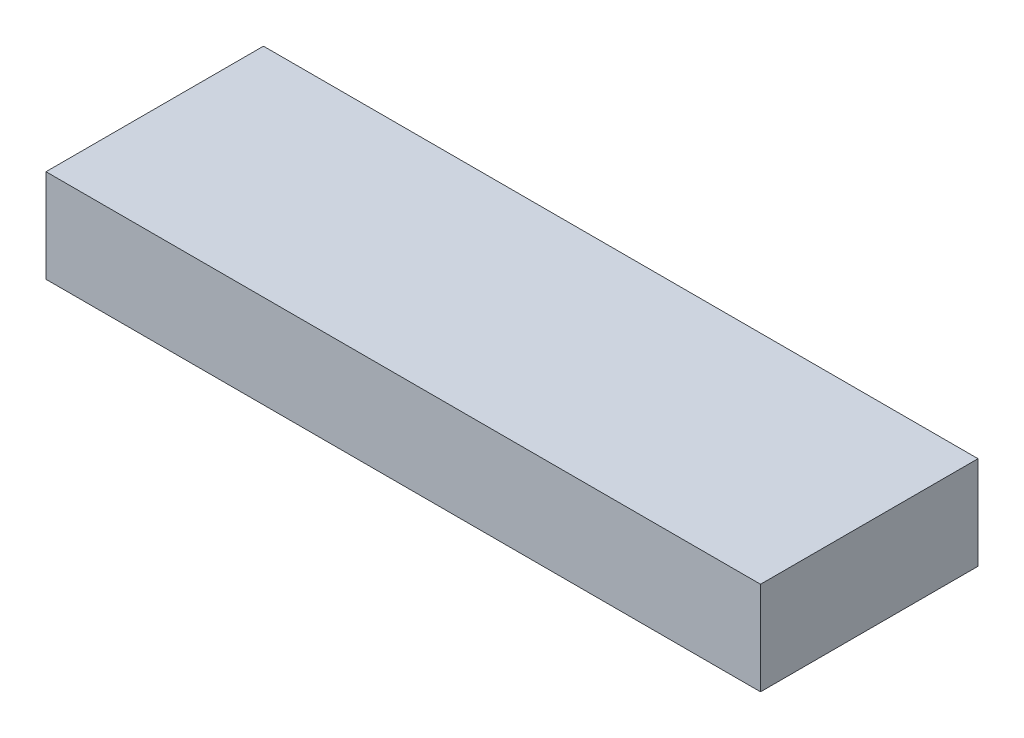
ISO-10303-21;
HEADER;
FILE_DESCRIPTION(('STEP AP214'),'2;1');
FILE_NAME('part.step','',(''),(''),'','','');
FILE_SCHEMA(('AUTOMOTIVE_DESIGN { 1 0 10303 214 1 1 1 1 }'));
ENDSEC;
DATA;
#1=APPLICATION_CONTEXT('core data for automotive mechanical design processes');
#2=APPLICATION_PROTOCOL_DEFINITION('international standard','automotive_design',2000,#1);
#3=PRODUCT_CONTEXT('',#1,'mechanical');
#4=PRODUCT('Part','Part','',(#3));
#5=PRODUCT_RELATED_PRODUCT_CATEGORY('part','',(#4));
#6=PRODUCT_DEFINITION_FORMATION('','',#4);
#7=PRODUCT_DEFINITION_CONTEXT('part definition',#1,'design');
#8=PRODUCT_DEFINITION('design','',#6,#7);
#9=PRODUCT_DEFINITION_SHAPE('','',#8);
#10=(LENGTH_UNIT() NAMED_UNIT(*) SI_UNIT(.MILLI.,.METRE.));
#11=(NAMED_UNIT(*) PLANE_ANGLE_UNIT() SI_UNIT($,.RADIAN.));
#12=(NAMED_UNIT(*) SI_UNIT($,.STERADIAN.) SOLID_ANGLE_UNIT());
#13=UNCERTAINTY_MEASURE_WITH_UNIT(LENGTH_MEASURE(1.E-05),#10,'distance_accuracy_value','');
#14=(GEOMETRIC_REPRESENTATION_CONTEXT(3) GLOBAL_UNCERTAINTY_ASSIGNED_CONTEXT((#13)) GLOBAL_UNIT_ASSIGNED_CONTEXT((#10,
#11,#12)) REPRESENTATION_CONTEXT('',''));
#15=CARTESIAN_POINT('',(0.,0.,0.));
#16=DIRECTION('',(0.,0.,1.));
#17=DIRECTION('',(1.,0.,0.));
#18=AXIS2_PLACEMENT_3D('',#15,#16,#17);
#19=CARTESIAN_POINT('',(292.1,0.,0.));
#20=DIRECTION('',(0.,0.,-1.));
#21=DIRECTION('',(-1.,0.,0.));
#22=AXIS2_PLACEMENT_3D('',#19,#20,#21);
#23=PLANE('',#22);
#24=DIRECTION('',(0.,-1.,0.));
#25=VECTOR('',#24,1.);
#26=CARTESIAN_POINT('',(0.,0.,0.));
#27=LINE('',#26,#25);
#28=CARTESIAN_POINT('',(0.,38.1,0.));
#29=VERTEX_POINT('',#28);
#30=CARTESIAN_POINT('',(0.,0.,0.));
#31=VERTEX_POINT('',#30);
#32=EDGE_CURVE('E110',#29,#31,#27,.T.);
#33=ORIENTED_EDGE('',*,*,#32,.T.);
#34=DIRECTION('',(-1.,0.,0.));
#35=VECTOR('',#34,1.);
#36=CARTESIAN_POINT('',(292.1,0.,0.));
#37=LINE('',#36,#35);
#38=CARTESIAN_POINT('',(292.1,0.,0.));
#39=VERTEX_POINT('',#38);
#40=EDGE_CURVE('E11',#39,#31,#37,.T.);
#41=ORIENTED_EDGE('',*,*,#40,.F.);
#42=DIRECTION('',(0.,-1.,0.));
#43=VECTOR('',#42,1.);
#44=CARTESIAN_POINT('',(292.1,0.,0.));
#45=LINE('',#44,#43);
#46=CARTESIAN_POINT('',(292.1,38.1,0.));
#47=VERTEX_POINT('',#46);
#48=EDGE_CURVE('E93',#47,#39,#45,.T.);
#49=ORIENTED_EDGE('',*,*,#48,.F.);
#50=DIRECTION('',(-1.,0.,0.));
#51=VECTOR('',#50,1.);
#52=CARTESIAN_POINT('',(292.1,38.1,0.));
#53=LINE('',#52,#51);
#54=EDGE_CURVE('E106',#47,#29,#53,.T.);
#55=ORIENTED_EDGE('',*,*,#54,.T.);
#56=EDGE_LOOP('',(#33,#41,#49,#55));
#57=FACE_BOUND('',#56,.T.);
#58=ADVANCED_FACE('F41',(#57),#23,.F.);
#59=CARTESIAN_POINT('',(292.1,0.,0.));
#60=DIRECTION('',(0.,1.,0.));
#61=DIRECTION('',(0.,0.,1.));
#62=AXIS2_PLACEMENT_3D('',#59,#60,#61);
#63=PLANE('',#62);
#64=DIRECTION('',(0.,0.,-1.));
#65=VECTOR('',#64,1.);
#66=CARTESIAN_POINT('',(0.,0.,0.));
#67=LINE('',#66,#65);
#68=CARTESIAN_POINT('',(0.,0.,-88.9));
#69=VERTEX_POINT('',#68);
#70=EDGE_CURVE('E98',#31,#69,#67,.T.);
#71=ORIENTED_EDGE('',*,*,#70,.T.);
#72=DIRECTION('',(-1.,0.,0.));
#73=VECTOR('',#72,1.);
#74=CARTESIAN_POINT('',(292.1,0.,-88.9));
#75=LINE('',#74,#73);
#76=CARTESIAN_POINT('',(292.1,0.,-88.9));
#77=VERTEX_POINT('',#76);
#78=EDGE_CURVE('E50',#77,#69,#75,.T.);
#79=ORIENTED_EDGE('',*,*,#78,.F.);
#80=DIRECTION('',(0.,0.,-1.));
#81=VECTOR('',#80,1.);
#82=CARTESIAN_POINT('',(292.1,0.,0.));
#83=LINE('',#82,#81);
#84=EDGE_CURVE('E88',#39,#77,#83,.T.);
#85=ORIENTED_EDGE('',*,*,#84,.F.);
#86=ORIENTED_EDGE('',*,*,#40,.T.);
#87=EDGE_LOOP('',(#71,#79,#85,#86));
#88=FACE_BOUND('',#87,.T.);
#89=ADVANCED_FACE('F97',(#88),#63,.F.);
#90=CARTESIAN_POINT('',(292.1,0.,-88.9));
#91=DIRECTION('',(0.,0.,1.));
#92=DIRECTION('',(1.,0.,0.));
#93=AXIS2_PLACEMENT_3D('',#90,#91,#92);
#94=PLANE('',#93);
#95=DIRECTION('',(0.,1.,0.));
#96=VECTOR('',#95,1.);
#97=CARTESIAN_POINT('',(0.,0.,-88.9));
#98=LINE('',#97,#96);
#99=CARTESIAN_POINT('',(0.,38.1,-88.9));
#100=VERTEX_POINT('',#99);
#101=EDGE_CURVE('E75',#69,#100,#98,.T.);
#102=ORIENTED_EDGE('',*,*,#101,.T.);
#103=DIRECTION('',(-1.,0.,0.));
#104=VECTOR('',#103,1.);
#105=CARTESIAN_POINT('',(292.1,38.1,-88.9));
#106=LINE('',#105,#104);
#107=CARTESIAN_POINT('',(292.1,38.1,-88.9));
#108=VERTEX_POINT('',#107);
#109=EDGE_CURVE('E100',#108,#100,#106,.T.);
#110=ORIENTED_EDGE('',*,*,#109,.F.);
#111=DIRECTION('',(0.,1.,0.));
#112=VECTOR('',#111,1.);
#113=CARTESIAN_POINT('',(292.1,0.,-88.9));
#114=LINE('',#113,#112);
#115=EDGE_CURVE('E91',#77,#108,#114,.T.);
#116=ORIENTED_EDGE('',*,*,#115,.F.);
#117=ORIENTED_EDGE('',*,*,#78,.T.);
#118=EDGE_LOOP('',(#102,#110,#116,#117));
#119=FACE_BOUND('',#118,.T.);
#120=ADVANCED_FACE('F101',(#119),#94,.F.);
#121=CARTESIAN_POINT('',(292.1,38.1,0.));
#122=DIRECTION('',(0.,-1.,0.));
#123=DIRECTION('',(0.,0.,-1.));
#124=AXIS2_PLACEMENT_3D('',#121,#122,#123);
#125=PLANE('',#124);
#126=DIRECTION('',(0.,0.,1.));
#127=VECTOR('',#126,1.);
#128=CARTESIAN_POINT('',(0.,38.1,0.));
#129=LINE('',#128,#127);
#130=EDGE_CURVE('E81',#100,#29,#129,.T.);
#131=ORIENTED_EDGE('',*,*,#130,.T.);
#132=ORIENTED_EDGE('',*,*,#54,.F.);
#133=DIRECTION('',(0.,0.,1.));
#134=VECTOR('',#133,1.);
#135=CARTESIAN_POINT('',(292.1,38.1,0.));
#136=LINE('',#135,#134);
#137=EDGE_CURVE('E58',#108,#47,#136,.T.);
#138=ORIENTED_EDGE('',*,*,#137,.F.);
#139=ORIENTED_EDGE('',*,*,#109,.T.);
#140=EDGE_LOOP('',(#131,#132,#138,#139));
#141=FACE_BOUND('',#140,.T.);
#142=ADVANCED_FACE('F124',(#141),#125,.F.);
#143=CARTESIAN_POINT('',(292.1,0.,0.));
#144=DIRECTION('',(-1.,0.,0.));
#145=DIRECTION('',(0.,0.,1.));
#146=AXIS2_PLACEMENT_3D('',#143,#144,#145);
#147=PLANE('',#146);
#148=ORIENTED_EDGE('',*,*,#48,.T.);
#149=ORIENTED_EDGE('',*,*,#84,.T.);
#150=ORIENTED_EDGE('',*,*,#115,.T.);
#151=ORIENTED_EDGE('',*,*,#137,.T.);
#152=EDGE_LOOP('',(#148,#149,#150,#151));
#153=FACE_BOUND('',#152,.T.);
#154=ADVANCED_FACE('F89',(#153),#147,.F.);
#155=CARTESIAN_POINT('',(0.,0.,0.));
#156=DIRECTION('',(-1.,0.,0.));
#157=DIRECTION('',(0.,0.,1.));
#158=AXIS2_PLACEMENT_3D('',#155,#156,#157);
#159=PLANE('',#158);
#160=ORIENTED_EDGE('',*,*,#32,.F.);
#161=ORIENTED_EDGE('',*,*,#130,.F.);
#162=ORIENTED_EDGE('',*,*,#101,.F.);
#163=ORIENTED_EDGE('',*,*,#70,.F.);
#164=EDGE_LOOP('',(#160,#161,#162,#163));
#165=FACE_BOUND('',#164,.T.);
#166=ADVANCED_FACE('F127',(#165),#159,.T.);
#167=CLOSED_SHELL('',(#58,#89,#120,#142,#154,#166));
#168=MANIFOLD_SOLID_BREP('B2',#167);
#169=ADVANCED_BREP_SHAPE_REPRESENTATION('',(#18,#168),#14);
#170=SHAPE_DEFINITION_REPRESENTATION(#9,#169);
ENDSEC;
END-ISO-10303-21;
